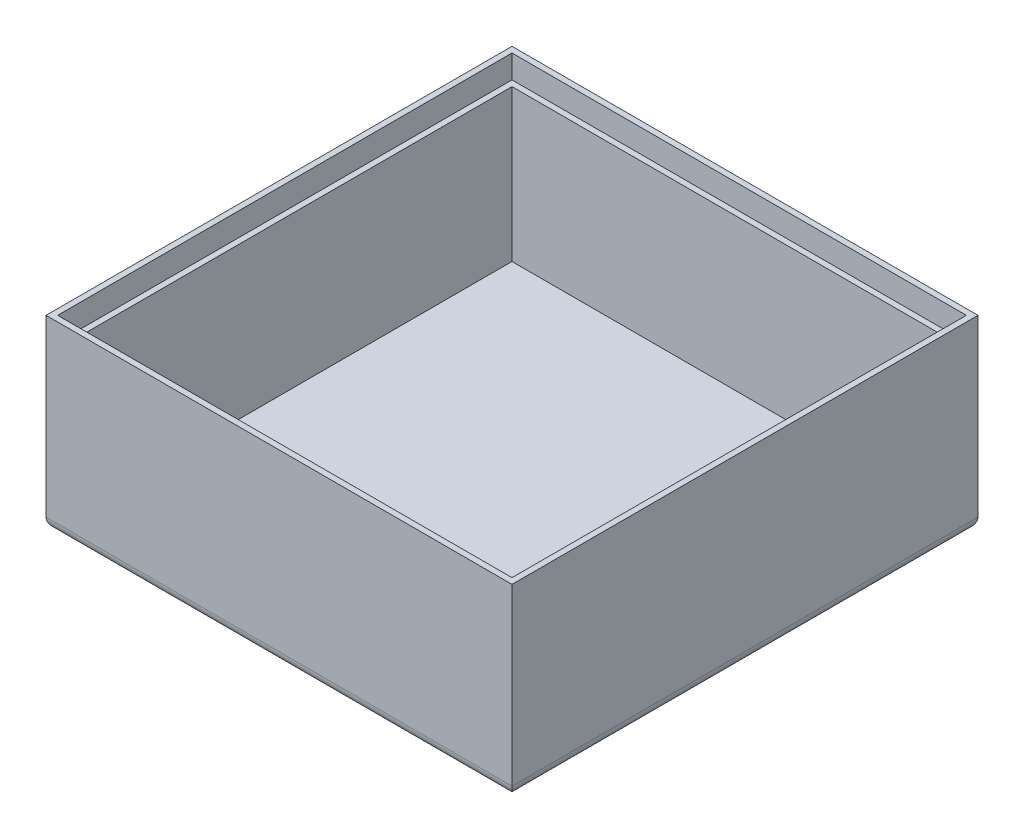
ISO-10303-21;
HEADER;
FILE_DESCRIPTION(('STEP AP214'),'2;1');
FILE_NAME('part.step','',(''),(''),'','','');
FILE_SCHEMA(('AUTOMOTIVE_DESIGN { 1 0 10303 214 1 1 1 1 }'));
ENDSEC;
DATA;
#1=APPLICATION_CONTEXT('core data for automotive mechanical design processes');
#2=APPLICATION_PROTOCOL_DEFINITION('international standard','automotive_design',2000,#1);
#3=PRODUCT_CONTEXT('',#1,'mechanical');
#4=PRODUCT('Part','Part','',(#3));
#5=PRODUCT_RELATED_PRODUCT_CATEGORY('part','',(#4));
#6=PRODUCT_DEFINITION_FORMATION('','',#4);
#7=PRODUCT_DEFINITION_CONTEXT('part definition',#1,'design');
#8=PRODUCT_DEFINITION('design','',#6,#7);
#9=PRODUCT_DEFINITION_SHAPE('','',#8);
#10=(LENGTH_UNIT() NAMED_UNIT(*) SI_UNIT(.MILLI.,.METRE.));
#11=(NAMED_UNIT(*) PLANE_ANGLE_UNIT() SI_UNIT($,.RADIAN.));
#12=(NAMED_UNIT(*) SI_UNIT($,.STERADIAN.) SOLID_ANGLE_UNIT());
#13=UNCERTAINTY_MEASURE_WITH_UNIT(LENGTH_MEASURE(1.E-05),#10,'distance_accuracy_value','');
#14=(GEOMETRIC_REPRESENTATION_CONTEXT(3) GLOBAL_UNCERTAINTY_ASSIGNED_CONTEXT((#13)) GLOBAL_UNIT_ASSIGNED_CONTEXT((#10,
#11,#12)) REPRESENTATION_CONTEXT('',''));
#15=CARTESIAN_POINT('',(0.,0.,0.));
#16=DIRECTION('',(0.,0.,1.));
#17=DIRECTION('',(1.,0.,0.));
#18=AXIS2_PLACEMENT_3D('',#15,#16,#17);
#19=CARTESIAN_POINT('',(-1.085,16.,-0.539));
#20=DIRECTION('',(1.,0.,0.));
#21=DIRECTION('',(0.,0.,-1.));
#22=AXIS2_PLACEMENT_3D('',#19,#20,#21);
#23=PLANE('',#22);
#24=DIRECTION('',(0.,-1.,0.));
#25=VECTOR('',#24,1.);
#26=CARTESIAN_POINT('',(-1.085,16.,-0.539));
#27=LINE('',#26,#25);
#28=CARTESIAN_POINT('',(-1.085,16.,-0.539));
#29=VERTEX_POINT('',#28);
#30=CARTESIAN_POINT('',(-1.085,1.,-0.539));
#31=VERTEX_POINT('',#30);
#32=EDGE_CURVE('E226',#29,#31,#27,.T.);
#33=ORIENTED_EDGE('',*,*,#32,.T.);
#34=DIRECTION('',(0.,0.,1.));
#35=VECTOR('',#34,1.);
#36=CARTESIAN_POINT('',(-1.085,1.,-0.539));
#37=LINE('',#36,#35);
#38=CARTESIAN_POINT('',(-1.085,1.,39.461));
#39=VERTEX_POINT('',#38);
#40=EDGE_CURVE('E44',#31,#39,#37,.T.);
#41=ORIENTED_EDGE('',*,*,#40,.T.);
#42=DIRECTION('',(0.,-1.,0.));
#43=VECTOR('',#42,1.);
#44=CARTESIAN_POINT('',(-1.085,16.,39.461));
#45=LINE('',#44,#43);
#46=CARTESIAN_POINT('',(-1.085,16.,39.461));
#47=VERTEX_POINT('',#46);
#48=EDGE_CURVE('E233',#47,#39,#45,.T.);
#49=ORIENTED_EDGE('',*,*,#48,.F.);
#50=DIRECTION('',(0.,0.,1.));
#51=VECTOR('',#50,1.);
#52=CARTESIAN_POINT('',(-1.085,16.,-0.539));
#53=LINE('',#52,#51);
#54=EDGE_CURVE('E209',#29,#47,#53,.T.);
#55=ORIENTED_EDGE('',*,*,#54,.F.);
#56=EDGE_LOOP('',(#33,#41,#49,#55));
#57=FACE_BOUND('',#56,.T.);
#58=ADVANCED_FACE('F35',(#57),#23,.F.);
#59=CARTESIAN_POINT('',(-1.085,16.,39.461));
#60=DIRECTION('',(0.,0.,-1.));
#61=DIRECTION('',(-1.,0.,0.));
#62=AXIS2_PLACEMENT_3D('',#59,#60,#61);
#63=PLANE('',#62);
#64=ORIENTED_EDGE('',*,*,#48,.T.);
#65=DIRECTION('',(1.,0.,0.));
#66=VECTOR('',#65,1.);
#67=CARTESIAN_POINT('',(-1.085,1.,39.461));
#68=LINE('',#67,#66);
#69=CARTESIAN_POINT('',(38.915,1.,39.461));
#70=VERTEX_POINT('',#69);
#71=EDGE_CURVE('E247',#39,#70,#68,.T.);
#72=ORIENTED_EDGE('',*,*,#71,.T.);
#73=DIRECTION('',(0.,-1.,0.));
#74=VECTOR('',#73,1.);
#75=CARTESIAN_POINT('',(38.915,16.,39.461));
#76=LINE('',#75,#74);
#77=CARTESIAN_POINT('',(38.915,16.,39.461));
#78=VERTEX_POINT('',#77);
#79=EDGE_CURVE('E230',#78,#70,#76,.T.);
#80=ORIENTED_EDGE('',*,*,#79,.F.);
#81=DIRECTION('',(1.,0.,0.));
#82=VECTOR('',#81,1.);
#83=CARTESIAN_POINT('',(-1.085,16.,39.461));
#84=LINE('',#83,#82);
#85=EDGE_CURVE('E220',#47,#78,#84,.T.);
#86=ORIENTED_EDGE('',*,*,#85,.F.);
#87=EDGE_LOOP('',(#64,#72,#80,#86));
#88=FACE_BOUND('',#87,.T.);
#89=ADVANCED_FACE('F285',(#88),#63,.F.);
#90=CARTESIAN_POINT('',(38.915,16.,-0.539));
#91=DIRECTION('',(-1.,0.,0.));
#92=DIRECTION('',(0.,0.,1.));
#93=AXIS2_PLACEMENT_3D('',#90,#91,#92);
#94=PLANE('',#93);
#95=ORIENTED_EDGE('',*,*,#79,.T.);
#96=DIRECTION('',(0.,0.,-1.));
#97=VECTOR('',#96,1.);
#98=CARTESIAN_POINT('',(38.915,1.,-0.539));
#99=LINE('',#98,#97);
#100=CARTESIAN_POINT('',(38.915,1.,-0.539));
#101=VERTEX_POINT('',#100);
#102=EDGE_CURVE('E235',#70,#101,#99,.T.);
#103=ORIENTED_EDGE('',*,*,#102,.T.);
#104=DIRECTION('',(0.,-1.,0.));
#105=VECTOR('',#104,1.);
#106=CARTESIAN_POINT('',(38.915,16.,-0.539));
#107=LINE('',#106,#105);
#108=CARTESIAN_POINT('',(38.915,16.,-0.539));
#109=VERTEX_POINT('',#108);
#110=EDGE_CURVE('E228',#109,#101,#107,.T.);
#111=ORIENTED_EDGE('',*,*,#110,.F.);
#112=DIRECTION('',(0.,0.,-1.));
#113=VECTOR('',#112,1.);
#114=CARTESIAN_POINT('',(38.915,16.,-0.539));
#115=LINE('',#114,#113);
#116=EDGE_CURVE('E222',#78,#109,#115,.T.);
#117=ORIENTED_EDGE('',*,*,#116,.F.);
#118=EDGE_LOOP('',(#95,#103,#111,#117));
#119=FACE_BOUND('',#118,.T.);
#120=ADVANCED_FACE('F276',(#119),#94,.F.);
#121=CARTESIAN_POINT('',(-1.085,16.,-0.539));
#122=DIRECTION('',(0.,0.,1.));
#123=DIRECTION('',(1.,0.,0.));
#124=AXIS2_PLACEMENT_3D('',#121,#122,#123);
#125=PLANE('',#124);
#126=ORIENTED_EDGE('',*,*,#110,.T.);
#127=DIRECTION('',(-1.,0.,0.));
#128=VECTOR('',#127,1.);
#129=CARTESIAN_POINT('',(-1.085,1.,-0.539));
#130=LINE('',#129,#128);
#131=EDGE_CURVE('E11',#101,#31,#130,.T.);
#132=ORIENTED_EDGE('',*,*,#131,.T.);
#133=ORIENTED_EDGE('',*,*,#32,.F.);
#134=DIRECTION('',(-1.,0.,0.));
#135=VECTOR('',#134,1.);
#136=CARTESIAN_POINT('',(-1.085,16.,-0.539));
#137=LINE('',#136,#135);
#138=EDGE_CURVE('E224',#109,#29,#137,.T.);
#139=ORIENTED_EDGE('',*,*,#138,.F.);
#140=EDGE_LOOP('',(#126,#132,#133,#139));
#141=FACE_BOUND('',#140,.T.);
#142=ADVANCED_FACE('F280',(#141),#125,.F.);
#143=CARTESIAN_POINT('',(0.,16.,0.));
#144=DIRECTION('',(0.,1.,0.));
#145=DIRECTION('',(0.,0.,1.));
#146=AXIS2_PLACEMENT_3D('',#143,#144,#145);
#147=PLANE('',#146);
#148=DIRECTION('',(-1.,0.,0.));
#149=VECTOR('',#148,1.);
#150=CARTESIAN_POINT('',(37.915,16.,-0.039));
#151=LINE('',#150,#149);
#152=CARTESIAN_POINT('',(38.415,16.,-0.0390000000000001));
#153=VERTEX_POINT('',#152);
#154=CARTESIAN_POINT('',(-0.585000000000013,16.,-0.039));
#155=VERTEX_POINT('',#154);
#156=EDGE_CURVE('E171',#153,#155,#151,.T.);
#157=ORIENTED_EDGE('',*,*,#156,.F.);
#158=DIRECTION('',(0.,0.,-1.));
#159=VECTOR('',#158,1.);
#160=CARTESIAN_POINT('',(38.415,16.,-0.0390000000000001));
#161=LINE('',#160,#159);
#162=CARTESIAN_POINT('',(38.415,16.,38.961));
#163=VERTEX_POINT('',#162);
#164=EDGE_CURVE('E163',#163,#153,#161,.T.);
#165=ORIENTED_EDGE('',*,*,#164,.F.);
#166=DIRECTION('',(1.,0.,0.));
#167=VECTOR('',#166,1.);
#168=CARTESIAN_POINT('',(37.915,16.,38.961));
#169=LINE('',#168,#167);
#170=CARTESIAN_POINT('',(-0.584999999999996,16.,38.961));
#171=VERTEX_POINT('',#170);
#172=EDGE_CURVE('E188',#171,#163,#169,.T.);
#173=ORIENTED_EDGE('',*,*,#172,.F.);
#174=DIRECTION('',(0.,0.,1.));
#175=VECTOR('',#174,1.);
#176=CARTESIAN_POINT('',(-0.585000000000001,16.,0.461));
#177=LINE('',#176,#175);
#178=EDGE_CURVE('E176',#155,#171,#177,.T.);
#179=ORIENTED_EDGE('',*,*,#178,.F.);
#180=EDGE_LOOP('',(#157,#165,#173,#179));
#181=FACE_BOUND('',#180,.T.);
#182=ORIENTED_EDGE('',*,*,#54,.T.);
#183=ORIENTED_EDGE('',*,*,#85,.T.);
#184=ORIENTED_EDGE('',*,*,#116,.T.);
#185=ORIENTED_EDGE('',*,*,#138,.T.);
#186=EDGE_LOOP('',(#182,#183,#184,#185));
#187=FACE_BOUND('',#186,.T.);
#188=ADVANCED_FACE('F283',(#181,#187),#147,.T.);
#189=CARTESIAN_POINT('',(0.,0.,0.));
#190=DIRECTION('',(0.,1.,0.));
#191=DIRECTION('',(0.,0.,1.));
#192=AXIS2_PLACEMENT_3D('',#189,#190,#191);
#193=PLANE('',#192);
#194=DIRECTION('',(-1.,0.,0.));
#195=VECTOR('',#194,1.);
#196=CARTESIAN_POINT('',(0.,0.,0.461));
#197=LINE('',#196,#195);
#198=CARTESIAN_POINT('',(-0.0850000000000003,0.,0.461));
#199=VERTEX_POINT('',#198);
#200=CARTESIAN_POINT('',(37.915,0.,0.461));
#201=VERTEX_POINT('',#200);
#202=EDGE_CURVE('E238',#199,#201,#197,.F.);
#203=ORIENTED_EDGE('',*,*,#202,.T.);
#204=DIRECTION('',(0.,0.,-1.));
#205=VECTOR('',#204,1.);
#206=CARTESIAN_POINT('',(37.915,0.,0.));
#207=LINE('',#206,#205);
#208=CARTESIAN_POINT('',(37.915,0.,38.461));
#209=VERTEX_POINT('',#208);
#210=EDGE_CURVE('E244',#201,#209,#207,.F.);
#211=ORIENTED_EDGE('',*,*,#210,.T.);
#212=DIRECTION('',(1.,0.,0.));
#213=VECTOR('',#212,1.);
#214=CARTESIAN_POINT('',(0.,0.,38.461));
#215=LINE('',#214,#213);
#216=CARTESIAN_POINT('',(-0.0849999999999956,0.,38.461));
#217=VERTEX_POINT('',#216);
#218=EDGE_CURVE('E242',#209,#217,#215,.F.);
#219=ORIENTED_EDGE('',*,*,#218,.T.);
#220=DIRECTION('',(0.,0.,1.));
#221=VECTOR('',#220,1.);
#222=CARTESIAN_POINT('',(-0.0850000000000004,0.,0.));
#223=LINE('',#222,#221);
#224=EDGE_CURVE('E240',#217,#199,#223,.F.);
#225=ORIENTED_EDGE('',*,*,#224,.T.);
#226=EDGE_LOOP('',(#203,#211,#219,#225));
#227=FACE_BOUND('',#226,.T.);
#228=ADVANCED_FACE('F267',(#227),#193,.F.);
#229=CARTESIAN_POINT('',(-0.0850000000000007,1.,0.461));
#230=DIRECTION('',(-1.,0.,0.));
#231=DIRECTION('',(0.,0.,1.));
#232=AXIS2_PLACEMENT_3D('',#229,#230,#231);
#233=PLANE('',#232);
#234=DIRECTION('',(0.,1.,0.));
#235=VECTOR('',#234,1.);
#236=CARTESIAN_POINT('',(-0.0850000000000007,1.,0.461));
#237=LINE('',#236,#235);
#238=CARTESIAN_POINT('',(-0.0850000000000007,1.,0.461));
#239=VERTEX_POINT('',#238);
#240=CARTESIAN_POINT('',(-0.0850000000000017,14.,0.461));
#241=VERTEX_POINT('',#240);
#242=EDGE_CURVE('E206',#239,#241,#237,.T.);
#243=ORIENTED_EDGE('',*,*,#242,.T.);
#244=DIRECTION('',(0.,0.,-1.));
#245=VECTOR('',#244,1.);
#246=CARTESIAN_POINT('',(-0.0850000000000007,14.,0.461));
#247=LINE('',#246,#245);
#248=CARTESIAN_POINT('',(-0.0849999999999961,14.,38.461));
#249=VERTEX_POINT('',#248);
#250=EDGE_CURVE('E150',#249,#241,#247,.T.);
#251=ORIENTED_EDGE('',*,*,#250,.F.);
#252=DIRECTION('',(0.,1.,0.));
#253=VECTOR('',#252,1.);
#254=CARTESIAN_POINT('',(-0.0849999999999958,1.,38.461));
#255=LINE('',#254,#253);
#256=CARTESIAN_POINT('',(-0.0849999999999958,1.,38.461));
#257=VERTEX_POINT('',#256);
#258=EDGE_CURVE('E205',#257,#249,#255,.T.);
#259=ORIENTED_EDGE('',*,*,#258,.F.);
#260=DIRECTION('',(0.,0.,1.));
#261=VECTOR('',#260,1.);
#262=CARTESIAN_POINT('',(-0.0850000000000007,1.,0.461));
#263=LINE('',#262,#261);
#264=EDGE_CURVE('E193',#239,#257,#263,.T.);
#265=ORIENTED_EDGE('',*,*,#264,.F.);
#266=EDGE_LOOP('',(#243,#251,#259,#265));
#267=FACE_BOUND('',#266,.T.);
#268=ADVANCED_FACE('F320',(#267),#233,.F.);
#269=CARTESIAN_POINT('',(-0.0850000000000007,1.,0.461));
#270=DIRECTION('',(0.,0.,-1.));
#271=DIRECTION('',(-1.,0.,0.));
#272=AXIS2_PLACEMENT_3D('',#269,#270,#271);
#273=PLANE('',#272);
#274=DIRECTION('',(0.,1.,0.));
#275=VECTOR('',#274,1.);
#276=CARTESIAN_POINT('',(37.915,1.,0.461));
#277=LINE('',#276,#275);
#278=CARTESIAN_POINT('',(37.915,1.,0.461));
#279=VERTEX_POINT('',#278);
#280=CARTESIAN_POINT('',(37.915,14.,0.461000000000003));
#281=VERTEX_POINT('',#280);
#282=EDGE_CURVE('E210',#279,#281,#277,.T.);
#283=ORIENTED_EDGE('',*,*,#282,.T.);
#284=DIRECTION('',(1.,0.,0.));
#285=VECTOR('',#284,1.);
#286=CARTESIAN_POINT('',(37.915,14.,0.461));
#287=LINE('',#286,#285);
#288=EDGE_CURVE('E169',#241,#281,#287,.T.);
#289=ORIENTED_EDGE('',*,*,#288,.F.);
#290=ORIENTED_EDGE('',*,*,#242,.F.);
#291=DIRECTION('',(-1.,0.,0.));
#292=VECTOR('',#291,1.);
#293=CARTESIAN_POINT('',(-0.0850000000000007,1.,0.461));
#294=LINE('',#293,#292);
#295=EDGE_CURVE('E202',#279,#239,#294,.T.);
#296=ORIENTED_EDGE('',*,*,#295,.F.);
#297=EDGE_LOOP('',(#283,#289,#290,#296));
#298=FACE_BOUND('',#297,.T.);
#299=ADVANCED_FACE('F317',(#298),#273,.F.);
#300=CARTESIAN_POINT('',(37.915,1.,0.461));
#301=DIRECTION('',(1.,0.,0.));
#302=DIRECTION('',(0.,0.,-1.));
#303=AXIS2_PLACEMENT_3D('',#300,#301,#302);
#304=PLANE('',#303);
#305=DIRECTION('',(0.,1.,0.));
#306=VECTOR('',#305,1.);
#307=CARTESIAN_POINT('',(37.915,1.,38.461));
#308=LINE('',#307,#306);
#309=CARTESIAN_POINT('',(37.915,1.,38.461));
#310=VERTEX_POINT('',#309);
#311=CARTESIAN_POINT('',(37.915,14.,38.461));
#312=VERTEX_POINT('',#311);
#313=EDGE_CURVE('E213',#310,#312,#308,.T.);
#314=ORIENTED_EDGE('',*,*,#313,.T.);
#315=DIRECTION('',(0.,0.,1.));
#316=VECTOR('',#315,1.);
#317=CARTESIAN_POINT('',(37.915,14.,-0.039));
#318=LINE('',#317,#316);
#319=EDGE_CURVE('E164',#281,#312,#318,.T.);
#320=ORIENTED_EDGE('',*,*,#319,.F.);
#321=ORIENTED_EDGE('',*,*,#282,.F.);
#322=DIRECTION('',(0.,0.,-1.));
#323=VECTOR('',#322,1.);
#324=CARTESIAN_POINT('',(37.915,1.,0.461));
#325=LINE('',#324,#323);
#326=EDGE_CURVE('E199',#310,#279,#325,.T.);
#327=ORIENTED_EDGE('',*,*,#326,.F.);
#328=EDGE_LOOP('',(#314,#320,#321,#327));
#329=FACE_BOUND('',#328,.T.);
#330=ADVANCED_FACE('F311',(#329),#304,.F.);
#331=CARTESIAN_POINT('',(-0.0849999999999958,1.,38.461));
#332=DIRECTION('',(0.,0.,1.));
#333=DIRECTION('',(1.,0.,0.));
#334=AXIS2_PLACEMENT_3D('',#331,#332,#333);
#335=PLANE('',#334);
#336=ORIENTED_EDGE('',*,*,#258,.T.);
#337=DIRECTION('',(-1.,0.,0.));
#338=VECTOR('',#337,1.);
#339=CARTESIAN_POINT('',(37.915,14.,38.461));
#340=LINE('',#339,#338);
#341=EDGE_CURVE('E184',#312,#249,#340,.T.);
#342=ORIENTED_EDGE('',*,*,#341,.F.);
#343=ORIENTED_EDGE('',*,*,#313,.F.);
#344=DIRECTION('',(1.,0.,0.));
#345=VECTOR('',#344,1.);
#346=CARTESIAN_POINT('',(-0.0849999999999958,1.,38.461));
#347=LINE('',#346,#345);
#348=EDGE_CURVE('E196',#257,#310,#347,.T.);
#349=ORIENTED_EDGE('',*,*,#348,.F.);
#350=EDGE_LOOP('',(#336,#342,#343,#349));
#351=FACE_BOUND('',#350,.T.);
#352=ADVANCED_FACE('F305',(#351),#335,.F.);
#353=CARTESIAN_POINT('',(0.,1.,0.));
#354=DIRECTION('',(0.,1.,0.));
#355=DIRECTION('',(0.,0.,1.));
#356=AXIS2_PLACEMENT_3D('',#353,#354,#355);
#357=PLANE('',#356);
#358=ORIENTED_EDGE('',*,*,#264,.T.);
#359=ORIENTED_EDGE('',*,*,#348,.T.);
#360=ORIENTED_EDGE('',*,*,#326,.T.);
#361=ORIENTED_EDGE('',*,*,#295,.T.);
#362=EDGE_LOOP('',(#358,#359,#360,#361));
#363=FACE_BOUND('',#362,.T.);
#364=ADVANCED_FACE('F301',(#363),#357,.T.);
#365=CARTESIAN_POINT('',(-0.0850000000000004,1.,-0.539));
#366=DIRECTION('',(0.,0.,1.));
#367=DIRECTION('',(1.,0.,0.));
#368=AXIS2_PLACEMENT_3D('',#365,#366,#367);
#369=CYLINDRICAL_SURFACE('',#368,1.);
#370=CARTESIAN_POINT('',(-0.0850000000000003,1.,0.461));
#371=DIRECTION('',(-0.707106781186547,0.,0.707106781186548));
#372=DIRECTION('',(-0.707106781186548,0.,-0.707106781186547));
#373=AXIS2_PLACEMENT_3D('',#370,#371,#372);
#374=ELLIPSE('',#373,1.4142135623731,1.);
#375=EDGE_CURVE('E252',#199,#31,#374,.F.);
#376=ORIENTED_EDGE('',*,*,#375,.F.);
#377=ORIENTED_EDGE('',*,*,#224,.F.);
#378=CARTESIAN_POINT('',(-0.0849999999999956,1.,38.461));
#379=DIRECTION('',(0.707106781186548,0.,0.707106781186547));
#380=DIRECTION('',(-0.707106781186547,0.,0.707106781186548));
#381=AXIS2_PLACEMENT_3D('',#378,#379,#380);
#382=ELLIPSE('',#381,1.41421356237309,1.);
#383=EDGE_CURVE('E39',#39,#217,#382,.T.);
#384=ORIENTED_EDGE('',*,*,#383,.F.);
#385=ORIENTED_EDGE('',*,*,#40,.F.);
#386=EDGE_LOOP('',(#376,#377,#384,#385));
#387=FACE_BOUND('',#386,.T.);
#388=ADVANCED_FACE('F37',(#387),#369,.T.);
#389=CARTESIAN_POINT('',(-1.085,1.,38.461));
#390=DIRECTION('',(1.,0.,0.));
#391=DIRECTION('',(0.,0.,-1.));
#392=AXIS2_PLACEMENT_3D('',#389,#390,#391);
#393=CYLINDRICAL_SURFACE('',#392,1.);
#394=ORIENTED_EDGE('',*,*,#383,.T.);
#395=ORIENTED_EDGE('',*,*,#218,.F.);
#396=CARTESIAN_POINT('',(37.915,1.,38.461));
#397=DIRECTION('',(0.707106781186547,0.,-0.707106781186548));
#398=DIRECTION('',(0.707106781186548,0.,0.707106781186547));
#399=AXIS2_PLACEMENT_3D('',#396,#397,#398);
#400=ELLIPSE('',#399,1.4142135623731,1.);
#401=EDGE_CURVE('E251',#70,#209,#400,.T.);
#402=ORIENTED_EDGE('',*,*,#401,.F.);
#403=ORIENTED_EDGE('',*,*,#71,.F.);
#404=EDGE_LOOP('',(#394,#395,#402,#403));
#405=FACE_BOUND('',#404,.T.);
#406=ADVANCED_FACE('F262',(#405),#393,.T.);
#407=CARTESIAN_POINT('',(-1.085,1.,0.461));
#408=DIRECTION('',(-1.,0.,0.));
#409=DIRECTION('',(0.,0.,1.));
#410=AXIS2_PLACEMENT_3D('',#407,#408,#409);
#411=CYLINDRICAL_SURFACE('',#410,1.);
#412=ORIENTED_EDGE('',*,*,#375,.T.);
#413=ORIENTED_EDGE('',*,*,#131,.F.);
#414=CARTESIAN_POINT('',(37.915,1.,0.461));
#415=DIRECTION('',(-0.707106781186548,0.,-0.707106781186547));
#416=DIRECTION('',(-0.707106781186547,0.,0.707106781186548));
#417=AXIS2_PLACEMENT_3D('',#414,#415,#416);
#418=ELLIPSE('',#417,1.41421356237309,1.);
#419=EDGE_CURVE('E190',#201,#101,#418,.F.);
#420=ORIENTED_EDGE('',*,*,#419,.F.);
#421=ORIENTED_EDGE('',*,*,#202,.F.);
#422=EDGE_LOOP('',(#412,#413,#420,#421));
#423=FACE_BOUND('',#422,.T.);
#424=ADVANCED_FACE('F273',(#423),#411,.T.);
#425=CARTESIAN_POINT('',(37.915,1.,-0.539));
#426=DIRECTION('',(0.,0.,-1.));
#427=DIRECTION('',(-1.,0.,0.));
#428=AXIS2_PLACEMENT_3D('',#425,#426,#427);
#429=CYLINDRICAL_SURFACE('',#428,1.);
#430=ORIENTED_EDGE('',*,*,#401,.T.);
#431=ORIENTED_EDGE('',*,*,#210,.F.);
#432=ORIENTED_EDGE('',*,*,#419,.T.);
#433=ORIENTED_EDGE('',*,*,#102,.F.);
#434=EDGE_LOOP('',(#430,#431,#432,#433));
#435=FACE_BOUND('',#434,.T.);
#436=ADVANCED_FACE('F271',(#435),#429,.T.);
#437=CARTESIAN_POINT('',(37.915,14.,38.961));
#438=DIRECTION('',(0.,-1.,0.));
#439=DIRECTION('',(0.,0.,-1.));
#440=AXIS2_PLACEMENT_3D('',#437,#438,#439);
#441=PLANE('',#440);
#442=ORIENTED_EDGE('',*,*,#319,.T.);
#443=ORIENTED_EDGE('',*,*,#341,.T.);
#444=ORIENTED_EDGE('',*,*,#250,.T.);
#445=ORIENTED_EDGE('',*,*,#288,.T.);
#446=EDGE_LOOP('',(#442,#443,#444,#445));
#447=FACE_BOUND('',#446,.T.);
#448=DIRECTION('',(-1.,0.,0.));
#449=VECTOR('',#448,1.);
#450=CARTESIAN_POINT('',(37.915,14.,38.961));
#451=LINE('',#450,#449);
#452=CARTESIAN_POINT('',(38.415,14.,38.961));
#453=VERTEX_POINT('',#452);
#454=CARTESIAN_POINT('',(-0.584999999999996,14.,38.961));
#455=VERTEX_POINT('',#454);
#456=EDGE_CURVE('E155',#453,#455,#451,.T.);
#457=ORIENTED_EDGE('',*,*,#456,.F.);
#458=DIRECTION('',(0.,0.,1.));
#459=VECTOR('',#458,1.);
#460=CARTESIAN_POINT('',(38.415,14.,-0.0390000000000001));
#461=LINE('',#460,#459);
#462=CARTESIAN_POINT('',(38.415,14.,-0.0390000000000001));
#463=VERTEX_POINT('',#462);
#464=EDGE_CURVE('E153',#463,#453,#461,.T.);
#465=ORIENTED_EDGE('',*,*,#464,.F.);
#466=DIRECTION('',(1.,0.,0.));
#467=VECTOR('',#466,1.);
#468=CARTESIAN_POINT('',(37.915,14.,-0.039));
#469=LINE('',#468,#467);
#470=CARTESIAN_POINT('',(-0.585000000000006,14.,-0.039));
#471=VERTEX_POINT('',#470);
#472=EDGE_CURVE('E139',#471,#463,#469,.T.);
#473=ORIENTED_EDGE('',*,*,#472,.F.);
#474=DIRECTION('',(0.,0.,-1.));
#475=VECTOR('',#474,1.);
#476=CARTESIAN_POINT('',(-0.585000000000001,14.,0.461));
#477=LINE('',#476,#475);
#478=EDGE_CURVE('E182',#455,#471,#477,.T.);
#479=ORIENTED_EDGE('',*,*,#478,.F.);
#480=EDGE_LOOP('',(#457,#465,#473,#479));
#481=FACE_BOUND('',#480,.T.);
#482=ADVANCED_FACE('F154',(#447,#481),#441,.F.);
#483=CARTESIAN_POINT('',(0.,0.,38.961));
#484=DIRECTION('',(0.,0.,-1.));
#485=DIRECTION('',(-1.,0.,0.));
#486=AXIS2_PLACEMENT_3D('',#483,#484,#485);
#487=PLANE('',#486);
#488=ORIENTED_EDGE('',*,*,#172,.T.);
#489=DIRECTION('',(0.,1.,0.));
#490=VECTOR('',#489,1.);
#491=CARTESIAN_POINT('',(38.415,16.,38.961));
#492=LINE('',#491,#490);
#493=EDGE_CURVE('E159',#453,#163,#492,.T.);
#494=ORIENTED_EDGE('',*,*,#493,.F.);
#495=ORIENTED_EDGE('',*,*,#456,.T.);
#496=DIRECTION('',(0.,-1.,0.));
#497=VECTOR('',#496,1.);
#498=CARTESIAN_POINT('',(-0.584999999999996,16.,38.961));
#499=LINE('',#498,#497);
#500=EDGE_CURVE('E179',#171,#455,#499,.T.);
#501=ORIENTED_EDGE('',*,*,#500,.F.);
#502=EDGE_LOOP('',(#488,#494,#495,#501));
#503=FACE_BOUND('',#502,.T.);
#504=ADVANCED_FACE('F380',(#503),#487,.T.);
#505=CARTESIAN_POINT('',(-0.585000000000001,0.,0.));
#506=DIRECTION('',(-1.,0.,0.));
#507=DIRECTION('',(0.,0.,1.));
#508=AXIS2_PLACEMENT_3D('',#505,#506,#507);
#509=PLANE('',#508);
#510=ORIENTED_EDGE('',*,*,#478,.T.);
#511=DIRECTION('',(0.,-1.,0.));
#512=VECTOR('',#511,1.);
#513=CARTESIAN_POINT('',(-0.585000000000013,16.,-0.039));
#514=LINE('',#513,#512);
#515=EDGE_CURVE('E147',#155,#471,#514,.T.);
#516=ORIENTED_EDGE('',*,*,#515,.F.);
#517=ORIENTED_EDGE('',*,*,#178,.T.);
#518=ORIENTED_EDGE('',*,*,#500,.T.);
#519=EDGE_LOOP('',(#510,#516,#517,#518));
#520=FACE_BOUND('',#519,.T.);
#521=ADVANCED_FACE('F391',(#520),#509,.F.);
#522=CARTESIAN_POINT('',(0.,0.,-0.039));
#523=DIRECTION('',(0.,0.,-1.));
#524=DIRECTION('',(-1.,0.,0.));
#525=AXIS2_PLACEMENT_3D('',#522,#523,#524);
#526=PLANE('',#525);
#527=ORIENTED_EDGE('',*,*,#472,.T.);
#528=DIRECTION('',(0.,-1.,0.));
#529=VECTOR('',#528,1.);
#530=CARTESIAN_POINT('',(38.415,16.,-0.0390000000000001));
#531=LINE('',#530,#529);
#532=EDGE_CURVE('E144',#153,#463,#531,.T.);
#533=ORIENTED_EDGE('',*,*,#532,.F.);
#534=ORIENTED_EDGE('',*,*,#156,.T.);
#535=ORIENTED_EDGE('',*,*,#515,.T.);
#536=EDGE_LOOP('',(#527,#533,#534,#535));
#537=FACE_BOUND('',#536,.T.);
#538=ADVANCED_FACE('F141',(#537),#526,.F.);
#539=CARTESIAN_POINT('',(38.415,0.,0.));
#540=DIRECTION('',(-1.,0.,0.));
#541=DIRECTION('',(0.,0.,1.));
#542=AXIS2_PLACEMENT_3D('',#539,#540,#541);
#543=PLANE('',#542);
#544=ORIENTED_EDGE('',*,*,#532,.T.);
#545=ORIENTED_EDGE('',*,*,#464,.T.);
#546=ORIENTED_EDGE('',*,*,#493,.T.);
#547=ORIENTED_EDGE('',*,*,#164,.T.);
#548=EDGE_LOOP('',(#544,#545,#546,#547));
#549=FACE_BOUND('',#548,.T.);
#550=ADVANCED_FACE('F161',(#549),#543,.T.);
#551=CLOSED_SHELL('',(#58,#89,#120,#142,#188,#228,#268,#299,#330,#352,#364,#388,#406,#424,#436,
#482,#504,#521,#538,#550));
#552=MANIFOLD_SOLID_BREP('B2',#551);
#553=ADVANCED_BREP_SHAPE_REPRESENTATION('',(#18,#552),#14);
#554=SHAPE_DEFINITION_REPRESENTATION(#9,#553);
ENDSEC;
END-ISO-10303-21;
